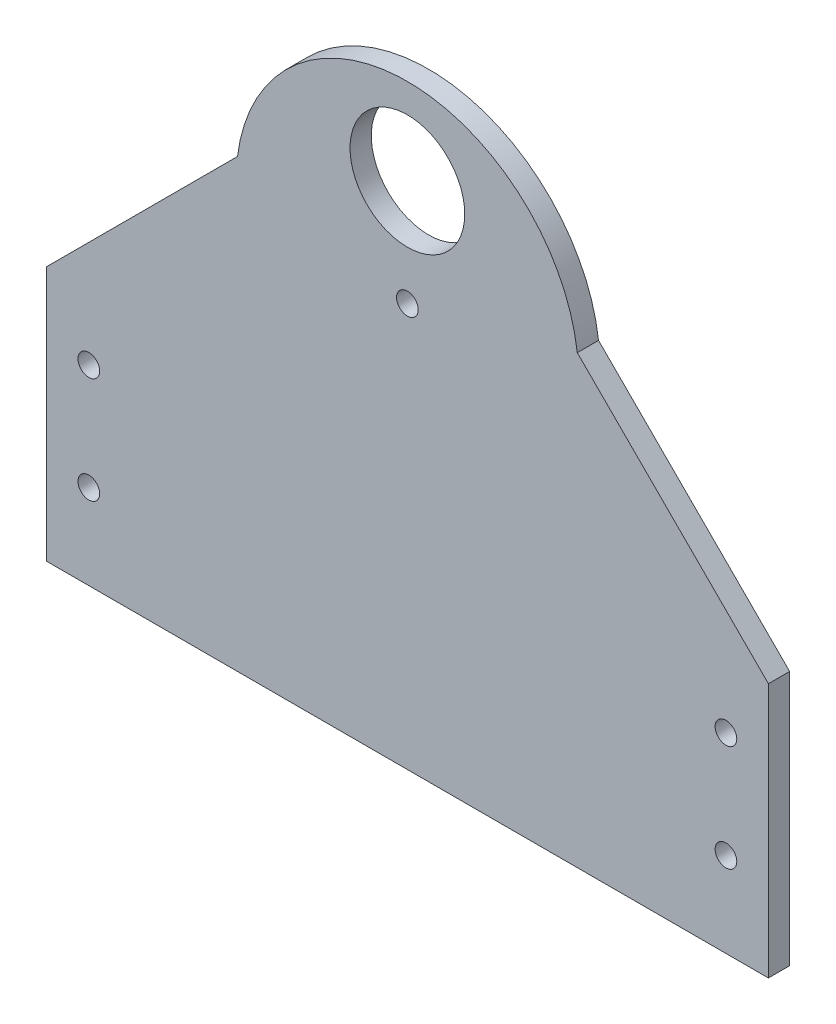
ISO-10303-21;
HEADER;
FILE_DESCRIPTION(('STEP AP214'),'2;1');
FILE_NAME('part.step','',(''),(''),'','','');
FILE_SCHEMA(('AUTOMOTIVE_DESIGN { 1 0 10303 214 1 1 1 1 }'));
ENDSEC;
DATA;
#1=APPLICATION_CONTEXT('core data for automotive mechanical design processes');
#2=APPLICATION_PROTOCOL_DEFINITION('international standard','automotive_design',2000,#1);
#3=PRODUCT_CONTEXT('',#1,'mechanical');
#4=PRODUCT('Part','Part','',(#3));
#5=PRODUCT_RELATED_PRODUCT_CATEGORY('part','',(#4));
#6=PRODUCT_DEFINITION_FORMATION('','',#4);
#7=PRODUCT_DEFINITION_CONTEXT('part definition',#1,'design');
#8=PRODUCT_DEFINITION('design','',#6,#7);
#9=PRODUCT_DEFINITION_SHAPE('','',#8);
#10=(LENGTH_UNIT() NAMED_UNIT(*) SI_UNIT(.MILLI.,.METRE.));
#11=(NAMED_UNIT(*) PLANE_ANGLE_UNIT() SI_UNIT($,.RADIAN.));
#12=(NAMED_UNIT(*) SI_UNIT($,.STERADIAN.) SOLID_ANGLE_UNIT());
#13=UNCERTAINTY_MEASURE_WITH_UNIT(LENGTH_MEASURE(1.E-05),#10,'distance_accuracy_value','');
#14=(GEOMETRIC_REPRESENTATION_CONTEXT(3) GLOBAL_UNCERTAINTY_ASSIGNED_CONTEXT((#13)) GLOBAL_UNIT_ASSIGNED_CONTEXT((#10,
#11,#12)) REPRESENTATION_CONTEXT('',''));
#15=CARTESIAN_POINT('',(0.,0.,0.));
#16=DIRECTION('',(0.,0.,1.));
#17=DIRECTION('',(1.,0.,0.));
#18=AXIS2_PLACEMENT_3D('',#15,#16,#17);
#19=CARTESIAN_POINT('',(0.,28.5999999999999,5.));
#20=DIRECTION('',(0.,0.,-1.));
#21=DIRECTION('',(-1.,0.,0.));
#22=AXIS2_PLACEMENT_3D('',#19,#20,#21);
#23=PLANE('',#22);
#24=DIRECTION('',(1.,0.,0.));
#25=VECTOR('',#24,1.);
#26=CARTESIAN_POINT('',(85.,-71.3999999999999,5.));
#27=LINE('',#26,#25);
#28=CARTESIAN_POINT('',(-85.,-71.3999999999999,5.));
#29=VERTEX_POINT('',#28);
#30=CARTESIAN_POINT('',(85.,-71.3999999999999,5.));
#31=VERTEX_POINT('',#30);
#32=EDGE_CURVE('E129',#29,#31,#27,.T.);
#33=ORIENTED_EDGE('',*,*,#32,.T.);
#34=DIRECTION('',(0.,1.,0.));
#35=VECTOR('',#34,1.);
#36=CARTESIAN_POINT('',(85.,-11.3999999999999,5.));
#37=LINE('',#36,#35);
#38=CARTESIAN_POINT('',(85.,-11.3999999999999,5.));
#39=VERTEX_POINT('',#38);
#40=EDGE_CURVE('E87',#31,#39,#37,.T.);
#41=ORIENTED_EDGE('',*,*,#40,.T.);
#42=DIRECTION('',(-0.707106781186549,0.707106781186546,0.));
#43=VECTOR('',#42,1.);
#44=CARTESIAN_POINT('',(40.,33.6,5.));
#45=LINE('',#44,#43);
#46=CARTESIAN_POINT('',(40.,33.6,5.));
#47=VERTEX_POINT('',#46);
#48=EDGE_CURVE('E100',#39,#47,#45,.T.);
#49=ORIENTED_EDGE('',*,*,#48,.T.);
#50=CARTESIAN_POINT('',(0.,28.5999999999999,5.));
#51=DIRECTION('',(0.,0.,1.));
#52=DIRECTION('',(-1.,0.,0.));
#53=AXIS2_PLACEMENT_3D('',#50,#51,#52);
#54=CIRCLE('',#53,40.3112887414928);
#55=CARTESIAN_POINT('',(-40.,33.6,5.));
#56=VERTEX_POINT('',#55);
#57=EDGE_CURVE('E94',#47,#56,#54,.T.);
#58=ORIENTED_EDGE('',*,*,#57,.T.);
#59=DIRECTION('',(-0.707106781186549,-0.707106781186546,0.));
#60=VECTOR('',#59,1.);
#61=CARTESIAN_POINT('',(-85.,-11.3999999999999,5.));
#62=LINE('',#61,#60);
#63=CARTESIAN_POINT('',(-85.,-11.3999999999999,5.));
#64=VERTEX_POINT('',#63);
#65=EDGE_CURVE('E98',#56,#64,#62,.T.);
#66=ORIENTED_EDGE('',*,*,#65,.T.);
#67=DIRECTION('',(0.,-1.,0.));
#68=VECTOR('',#67,1.);
#69=CARTESIAN_POINT('',(-85.,-71.3999999999999,5.));
#70=LINE('',#69,#68);
#71=EDGE_CURVE('E50',#64,#29,#70,.T.);
#72=ORIENTED_EDGE('',*,*,#71,.T.);
#73=EDGE_LOOP('',(#33,#41,#49,#58,#66,#72));
#74=FACE_BOUND('',#73,.T.);
#75=CARTESIAN_POINT('',(75.,-26.3999999999999,5.));
#76=DIRECTION('',(0.,0.,1.));
#77=DIRECTION('',(1.,0.,0.));
#78=AXIS2_PLACEMENT_3D('',#75,#76,#77);
#79=CIRCLE('',#78,2.54999999999999);
#80=CARTESIAN_POINT('',(77.55,-26.3999999999999,5.));
#81=VERTEX_POINT('',#80);
#82=EDGE_CURVE('E122',#81,#81,#79,.T.);
#83=ORIENTED_EDGE('',*,*,#82,.F.);
#84=EDGE_LOOP('',(#83));
#85=FACE_BOUND('',#84,.T.);
#86=CARTESIAN_POINT('',(75.,-51.3999999999999,5.));
#87=DIRECTION('',(0.,0.,1.));
#88=DIRECTION('',(1.,0.,0.));
#89=AXIS2_PLACEMENT_3D('',#86,#87,#88);
#90=CIRCLE('',#89,2.54999999999999);
#91=CARTESIAN_POINT('',(77.55,-51.3999999999999,5.));
#92=VERTEX_POINT('',#91);
#93=EDGE_CURVE('E213',#92,#92,#90,.T.);
#94=ORIENTED_EDGE('',*,*,#93,.F.);
#95=EDGE_LOOP('',(#94));
#96=FACE_BOUND('',#95,.T.);
#97=CARTESIAN_POINT('',(-75.,-26.3999999999999,5.));
#98=DIRECTION('',(0.,0.,1.));
#99=DIRECTION('',(1.,0.,0.));
#100=AXIS2_PLACEMENT_3D('',#97,#98,#99);
#101=CIRCLE('',#100,2.54999999999999);
#102=CARTESIAN_POINT('',(-72.45,-26.3999999999999,5.));
#103=VERTEX_POINT('',#102);
#104=EDGE_CURVE('E207',#103,#103,#101,.T.);
#105=ORIENTED_EDGE('',*,*,#104,.F.);
#106=EDGE_LOOP('',(#105));
#107=FACE_BOUND('',#106,.T.);
#108=CARTESIAN_POINT('',(-75.,-51.3999999999999,5.));
#109=DIRECTION('',(0.,0.,1.));
#110=DIRECTION('',(1.,0.,0.));
#111=AXIS2_PLACEMENT_3D('',#108,#109,#110);
#112=CIRCLE('',#111,2.54999999999999);
#113=CARTESIAN_POINT('',(-72.45,-51.3999999999999,5.));
#114=VERTEX_POINT('',#113);
#115=EDGE_CURVE('E201',#114,#114,#112,.T.);
#116=ORIENTED_EDGE('',*,*,#115,.F.);
#117=EDGE_LOOP('',(#116));
#118=FACE_BOUND('',#117,.T.);
#119=CARTESIAN_POINT('',(0.,23.6,5.));
#120=DIRECTION('',(0.,0.,1.));
#121=DIRECTION('',(1.,0.,0.));
#122=AXIS2_PLACEMENT_3D('',#119,#120,#121);
#123=CIRCLE('',#122,2.55);
#124=CARTESIAN_POINT('',(2.55000000000001,23.6,5.));
#125=VERTEX_POINT('',#124);
#126=EDGE_CURVE('E195',#125,#125,#123,.T.);
#127=ORIENTED_EDGE('',*,*,#126,.F.);
#128=EDGE_LOOP('',(#127));
#129=FACE_BOUND('',#128,.T.);
#130=CARTESIAN_POINT('',(0.,48.6,5.));
#131=DIRECTION('',(0.,0.,1.));
#132=DIRECTION('',(1.,0.,0.));
#133=AXIS2_PLACEMENT_3D('',#130,#131,#132);
#134=CIRCLE('',#133,13.5);
#135=CARTESIAN_POINT('',(13.5,48.6,5.));
#136=VERTEX_POINT('',#135);
#137=EDGE_CURVE('E186',#136,#136,#134,.T.);
#138=ORIENTED_EDGE('',*,*,#137,.F.);
#139=EDGE_LOOP('',(#138));
#140=FACE_BOUND('',#139,.T.);
#141=ADVANCED_FACE('F33',(#74,#85,#96,#107,#118,#129,#140),#23,.F.);
#142=CARTESIAN_POINT('',(0.,28.5999999999999,0.));
#143=DIRECTION('',(0.,0.,-1.));
#144=DIRECTION('',(-1.,0.,0.));
#145=AXIS2_PLACEMENT_3D('',#142,#143,#144);
#146=PLANE('',#145);
#147=CARTESIAN_POINT('',(0.,23.6,0.));
#148=DIRECTION('',(0.,0.,1.));
#149=DIRECTION('',(1.,0.,0.));
#150=AXIS2_PLACEMENT_3D('',#147,#148,#149);
#151=CIRCLE('',#150,2.55);
#152=CARTESIAN_POINT('',(2.55000000000001,23.6,0.));
#153=VERTEX_POINT('',#152);
#154=EDGE_CURVE('E192',#153,#153,#151,.T.);
#155=ORIENTED_EDGE('',*,*,#154,.T.);
#156=EDGE_LOOP('',(#155));
#157=FACE_BOUND('',#156,.T.);
#158=CARTESIAN_POINT('',(-75.,-26.3999999999999,0.));
#159=DIRECTION('',(0.,0.,1.));
#160=DIRECTION('',(1.,0.,0.));
#161=AXIS2_PLACEMENT_3D('',#158,#159,#160);
#162=CIRCLE('',#161,2.54999999999999);
#163=CARTESIAN_POINT('',(-72.45,-26.3999999999999,0.));
#164=VERTEX_POINT('',#163);
#165=EDGE_CURVE('E204',#164,#164,#162,.T.);
#166=ORIENTED_EDGE('',*,*,#165,.T.);
#167=EDGE_LOOP('',(#166));
#168=FACE_BOUND('',#167,.T.);
#169=CARTESIAN_POINT('',(75.,-26.3999999999999,0.));
#170=DIRECTION('',(0.,0.,1.));
#171=DIRECTION('',(1.,0.,0.));
#172=AXIS2_PLACEMENT_3D('',#169,#170,#171);
#173=CIRCLE('',#172,2.54999999999999);
#174=CARTESIAN_POINT('',(77.55,-26.3999999999999,0.));
#175=VERTEX_POINT('',#174);
#176=EDGE_CURVE('E216',#175,#175,#173,.T.);
#177=ORIENTED_EDGE('',*,*,#176,.T.);
#178=EDGE_LOOP('',(#177));
#179=FACE_BOUND('',#178,.T.);
#180=DIRECTION('',(1.,0.,0.));
#181=VECTOR('',#180,1.);
#182=CARTESIAN_POINT('',(85.,-71.3999999999999,0.));
#183=LINE('',#182,#181);
#184=CARTESIAN_POINT('',(-85.,-71.3999999999999,0.));
#185=VERTEX_POINT('',#184);
#186=CARTESIAN_POINT('',(85.,-71.3999999999999,0.));
#187=VERTEX_POINT('',#186);
#188=EDGE_CURVE('E118',#185,#187,#183,.T.);
#189=ORIENTED_EDGE('',*,*,#188,.F.);
#190=DIRECTION('',(0.,-1.,0.));
#191=VECTOR('',#190,1.);
#192=CARTESIAN_POINT('',(-85.,-71.3999999999999,0.));
#193=LINE('',#192,#191);
#194=CARTESIAN_POINT('',(-85.,-11.3999999999999,0.));
#195=VERTEX_POINT('',#194);
#196=EDGE_CURVE('E79',#195,#185,#193,.T.);
#197=ORIENTED_EDGE('',*,*,#196,.F.);
#198=DIRECTION('',(-0.707106781186549,-0.707106781186546,0.));
#199=VECTOR('',#198,1.);
#200=CARTESIAN_POINT('',(-85.,-11.3999999999999,0.));
#201=LINE('',#200,#199);
#202=CARTESIAN_POINT('',(-40.,33.6,0.));
#203=VERTEX_POINT('',#202);
#204=EDGE_CURVE('E73',#203,#195,#201,.T.);
#205=ORIENTED_EDGE('',*,*,#204,.F.);
#206=CARTESIAN_POINT('',(0.,28.5999999999999,0.));
#207=DIRECTION('',(0.,0.,1.));
#208=DIRECTION('',(-1.,0.,0.));
#209=AXIS2_PLACEMENT_3D('',#206,#207,#208);
#210=CIRCLE('',#209,40.3112887414928);
#211=CARTESIAN_POINT('',(40.,33.6,0.));
#212=VERTEX_POINT('',#211);
#213=EDGE_CURVE('E108',#212,#203,#210,.T.);
#214=ORIENTED_EDGE('',*,*,#213,.F.);
#215=DIRECTION('',(-0.707106781186549,0.707106781186546,0.));
#216=VECTOR('',#215,1.);
#217=CARTESIAN_POINT('',(40.,33.6,0.));
#218=LINE('',#217,#216);
#219=CARTESIAN_POINT('',(85.,-11.3999999999999,0.));
#220=VERTEX_POINT('',#219);
#221=EDGE_CURVE('E124',#220,#212,#218,.T.);
#222=ORIENTED_EDGE('',*,*,#221,.F.);
#223=DIRECTION('',(0.,1.,0.));
#224=VECTOR('',#223,1.);
#225=CARTESIAN_POINT('',(85.,-11.3999999999999,0.));
#226=LINE('',#225,#224);
#227=EDGE_CURVE('E121',#187,#220,#226,.T.);
#228=ORIENTED_EDGE('',*,*,#227,.F.);
#229=EDGE_LOOP('',(#189,#197,#205,#214,#222,#228));
#230=FACE_BOUND('',#229,.T.);
#231=CARTESIAN_POINT('',(75.,-51.3999999999999,0.));
#232=DIRECTION('',(0.,0.,1.));
#233=DIRECTION('',(1.,0.,0.));
#234=AXIS2_PLACEMENT_3D('',#231,#232,#233);
#235=CIRCLE('',#234,2.54999999999999);
#236=CARTESIAN_POINT('',(77.55,-51.3999999999999,0.));
#237=VERTEX_POINT('',#236);
#238=EDGE_CURVE('E210',#237,#237,#235,.T.);
#239=ORIENTED_EDGE('',*,*,#238,.T.);
#240=EDGE_LOOP('',(#239));
#241=FACE_BOUND('',#240,.T.);
#242=CARTESIAN_POINT('',(-75.,-51.3999999999999,0.));
#243=DIRECTION('',(0.,0.,1.));
#244=DIRECTION('',(1.,0.,0.));
#245=AXIS2_PLACEMENT_3D('',#242,#243,#244);
#246=CIRCLE('',#245,2.54999999999999);
#247=CARTESIAN_POINT('',(-72.45,-51.3999999999999,0.));
#248=VERTEX_POINT('',#247);
#249=EDGE_CURVE('E198',#248,#248,#246,.T.);
#250=ORIENTED_EDGE('',*,*,#249,.T.);
#251=EDGE_LOOP('',(#250));
#252=FACE_BOUND('',#251,.T.);
#253=CARTESIAN_POINT('',(0.,48.6,0.));
#254=DIRECTION('',(0.,0.,1.));
#255=DIRECTION('',(1.,0.,0.));
#256=AXIS2_PLACEMENT_3D('',#253,#254,#255);
#257=CIRCLE('',#256,13.5);
#258=CARTESIAN_POINT('',(13.5,48.6,0.));
#259=VERTEX_POINT('',#258);
#260=EDGE_CURVE('E189',#259,#259,#257,.T.);
#261=ORIENTED_EDGE('',*,*,#260,.T.);
#262=EDGE_LOOP('',(#261));
#263=FACE_BOUND('',#262,.T.);
#264=ADVANCED_FACE('F138',(#157,#168,#179,#230,#241,#252,#263),#146,.T.);
#265=CARTESIAN_POINT('',(85.,-71.3999999999999,5.));
#266=DIRECTION('',(0.,1.,0.));
#267=DIRECTION('',(0.,0.,1.));
#268=AXIS2_PLACEMENT_3D('',#265,#266,#267);
#269=PLANE('',#268);
#270=ORIENTED_EDGE('',*,*,#188,.T.);
#271=DIRECTION('',(0.,0.,-1.));
#272=VECTOR('',#271,1.);
#273=CARTESIAN_POINT('',(85.,-71.3999999999999,5.));
#274=LINE('',#273,#272);
#275=EDGE_CURVE('E11',#31,#187,#274,.T.);
#276=ORIENTED_EDGE('',*,*,#275,.F.);
#277=ORIENTED_EDGE('',*,*,#32,.F.);
#278=DIRECTION('',(0.,0.,-1.));
#279=VECTOR('',#278,1.);
#280=CARTESIAN_POINT('',(-85.,-71.3999999999999,5.));
#281=LINE('',#280,#279);
#282=EDGE_CURVE('E114',#29,#185,#281,.T.);
#283=ORIENTED_EDGE('',*,*,#282,.T.);
#284=EDGE_LOOP('',(#270,#276,#277,#283));
#285=FACE_BOUND('',#284,.T.);
#286=ADVANCED_FACE('F35',(#285),#269,.F.);
#287=CARTESIAN_POINT('',(85.,-11.3999999999999,5.));
#288=DIRECTION('',(-1.,0.,0.));
#289=DIRECTION('',(0.,0.,1.));
#290=AXIS2_PLACEMENT_3D('',#287,#288,#289);
#291=PLANE('',#290);
#292=ORIENTED_EDGE('',*,*,#227,.T.);
#293=DIRECTION('',(0.,0.,-1.));
#294=VECTOR('',#293,1.);
#295=CARTESIAN_POINT('',(85.,-11.3999999999999,5.));
#296=LINE('',#295,#294);
#297=EDGE_CURVE('E42',#39,#220,#296,.T.);
#298=ORIENTED_EDGE('',*,*,#297,.F.);
#299=ORIENTED_EDGE('',*,*,#40,.F.);
#300=ORIENTED_EDGE('',*,*,#275,.T.);
#301=EDGE_LOOP('',(#292,#298,#299,#300));
#302=FACE_BOUND('',#301,.T.);
#303=ADVANCED_FACE('F294',(#302),#291,.F.);
#304=CARTESIAN_POINT('',(40.,33.6,5.));
#305=DIRECTION('',(-0.707106781186546,-0.707106781186549,0.));
#306=DIRECTION('',(0.707106781186549,-0.707106781186546,0.));
#307=AXIS2_PLACEMENT_3D('',#304,#305,#306);
#308=PLANE('',#307);
#309=ORIENTED_EDGE('',*,*,#221,.T.);
#310=DIRECTION('',(0.,0.,-1.));
#311=VECTOR('',#310,1.);
#312=CARTESIAN_POINT('',(40.,33.6,5.));
#313=LINE('',#312,#311);
#314=EDGE_CURVE('E109',#47,#212,#313,.T.);
#315=ORIENTED_EDGE('',*,*,#314,.F.);
#316=ORIENTED_EDGE('',*,*,#48,.F.);
#317=ORIENTED_EDGE('',*,*,#297,.T.);
#318=EDGE_LOOP('',(#309,#315,#316,#317));
#319=FACE_BOUND('',#318,.T.);
#320=ADVANCED_FACE('F135',(#319),#308,.F.);
#321=CARTESIAN_POINT('',(0.,28.5999999999999,5.));
#322=DIRECTION('',(0.,0.,-1.));
#323=DIRECTION('',(-1.,0.,0.));
#324=AXIS2_PLACEMENT_3D('',#321,#322,#323);
#325=CYLINDRICAL_SURFACE('',#324,40.3112887414928);
#326=ORIENTED_EDGE('',*,*,#213,.T.);
#327=DIRECTION('',(0.,0.,-1.));
#328=VECTOR('',#327,1.);
#329=CARTESIAN_POINT('',(-40.,33.6,5.));
#330=LINE('',#329,#328);
#331=EDGE_CURVE('E105',#56,#203,#330,.T.);
#332=ORIENTED_EDGE('',*,*,#331,.F.);
#333=ORIENTED_EDGE('',*,*,#57,.F.);
#334=ORIENTED_EDGE('',*,*,#314,.T.);
#335=EDGE_LOOP('',(#326,#332,#333,#334));
#336=FACE_BOUND('',#335,.T.);
#337=ADVANCED_FACE('F106',(#336),#325,.T.);
#338=CARTESIAN_POINT('',(-85.,-11.3999999999999,5.));
#339=DIRECTION('',(0.707106781186546,-0.707106781186549,0.));
#340=DIRECTION('',(0.707106781186549,0.707106781186546,0.));
#341=AXIS2_PLACEMENT_3D('',#338,#339,#340);
#342=PLANE('',#341);
#343=ORIENTED_EDGE('',*,*,#204,.T.);
#344=DIRECTION('',(0.,0.,-1.));
#345=VECTOR('',#344,1.);
#346=CARTESIAN_POINT('',(-85.,-11.3999999999999,5.));
#347=LINE('',#346,#345);
#348=EDGE_CURVE('E110',#64,#195,#347,.T.);
#349=ORIENTED_EDGE('',*,*,#348,.F.);
#350=ORIENTED_EDGE('',*,*,#65,.F.);
#351=ORIENTED_EDGE('',*,*,#331,.T.);
#352=EDGE_LOOP('',(#343,#349,#350,#351));
#353=FACE_BOUND('',#352,.T.);
#354=ADVANCED_FACE('F112',(#353),#342,.F.);
#355=CARTESIAN_POINT('',(-85.,-71.3999999999999,5.));
#356=DIRECTION('',(1.,0.,0.));
#357=DIRECTION('',(0.,0.,-1.));
#358=AXIS2_PLACEMENT_3D('',#355,#356,#357);
#359=PLANE('',#358);
#360=ORIENTED_EDGE('',*,*,#196,.T.);
#361=ORIENTED_EDGE('',*,*,#282,.F.);
#362=ORIENTED_EDGE('',*,*,#71,.F.);
#363=ORIENTED_EDGE('',*,*,#348,.T.);
#364=EDGE_LOOP('',(#360,#361,#362,#363));
#365=FACE_BOUND('',#364,.T.);
#366=ADVANCED_FACE('F143',(#365),#359,.F.);
#367=CARTESIAN_POINT('',(75.,-26.3999999999999,5.));
#368=DIRECTION('',(0.,0.,-1.));
#369=DIRECTION('',(-1.,0.,0.));
#370=AXIS2_PLACEMENT_3D('',#367,#368,#369);
#371=CYLINDRICAL_SURFACE('',#370,2.54999999999999);
#372=ORIENTED_EDGE('',*,*,#82,.T.);
#373=EDGE_LOOP('',(#372));
#374=FACE_BOUND('',#373,.T.);
#375=ORIENTED_EDGE('',*,*,#176,.F.);
#376=EDGE_LOOP('',(#375));
#377=FACE_BOUND('',#376,.T.);
#378=ADVANCED_FACE('F145',(#374,#377),#371,.F.);
#379=CARTESIAN_POINT('',(75.,-51.3999999999999,5.));
#380=DIRECTION('',(0.,0.,-1.));
#381=DIRECTION('',(-1.,0.,0.));
#382=AXIS2_PLACEMENT_3D('',#379,#380,#381);
#383=CYLINDRICAL_SURFACE('',#382,2.54999999999999);
#384=ORIENTED_EDGE('',*,*,#93,.T.);
#385=EDGE_LOOP('',(#384));
#386=FACE_BOUND('',#385,.T.);
#387=ORIENTED_EDGE('',*,*,#238,.F.);
#388=EDGE_LOOP('',(#387));
#389=FACE_BOUND('',#388,.T.);
#390=ADVANCED_FACE('F151',(#386,#389),#383,.F.);
#391=CARTESIAN_POINT('',(-75.,-26.3999999999999,5.));
#392=DIRECTION('',(0.,0.,-1.));
#393=DIRECTION('',(-1.,0.,0.));
#394=AXIS2_PLACEMENT_3D('',#391,#392,#393);
#395=CYLINDRICAL_SURFACE('',#394,2.54999999999999);
#396=ORIENTED_EDGE('',*,*,#104,.T.);
#397=EDGE_LOOP('',(#396));
#398=FACE_BOUND('',#397,.T.);
#399=ORIENTED_EDGE('',*,*,#165,.F.);
#400=EDGE_LOOP('',(#399));
#401=FACE_BOUND('',#400,.T.);
#402=ADVANCED_FACE('F165',(#398,#401),#395,.F.);
#403=CARTESIAN_POINT('',(-75.,-51.3999999999999,5.));
#404=DIRECTION('',(0.,0.,-1.));
#405=DIRECTION('',(-1.,0.,0.));
#406=AXIS2_PLACEMENT_3D('',#403,#404,#405);
#407=CYLINDRICAL_SURFACE('',#406,2.54999999999999);
#408=ORIENTED_EDGE('',*,*,#115,.T.);
#409=EDGE_LOOP('',(#408));
#410=FACE_BOUND('',#409,.T.);
#411=ORIENTED_EDGE('',*,*,#249,.F.);
#412=EDGE_LOOP('',(#411));
#413=FACE_BOUND('',#412,.T.);
#414=ADVANCED_FACE('F169',(#410,#413),#407,.F.);
#415=CARTESIAN_POINT('',(0.,23.6,5.));
#416=DIRECTION('',(0.,0.,-1.));
#417=DIRECTION('',(-1.,0.,0.));
#418=AXIS2_PLACEMENT_3D('',#415,#416,#417);
#419=CYLINDRICAL_SURFACE('',#418,2.55);
#420=ORIENTED_EDGE('',*,*,#126,.T.);
#421=EDGE_LOOP('',(#420));
#422=FACE_BOUND('',#421,.T.);
#423=ORIENTED_EDGE('',*,*,#154,.F.);
#424=EDGE_LOOP('',(#423));
#425=FACE_BOUND('',#424,.T.);
#426=ADVANCED_FACE('F173',(#422,#425),#419,.F.);
#427=CARTESIAN_POINT('',(0.,48.6,5.));
#428=DIRECTION('',(0.,0.,-1.));
#429=DIRECTION('',(-1.,0.,0.));
#430=AXIS2_PLACEMENT_3D('',#427,#428,#429);
#431=CYLINDRICAL_SURFACE('',#430,13.5);
#432=ORIENTED_EDGE('',*,*,#137,.T.);
#433=EDGE_LOOP('',(#432));
#434=FACE_BOUND('',#433,.T.);
#435=ORIENTED_EDGE('',*,*,#260,.F.);
#436=EDGE_LOOP('',(#435));
#437=FACE_BOUND('',#436,.T.);
#438=ADVANCED_FACE('F177',(#434,#437),#431,.F.);
#439=CLOSED_SHELL('',(#141,#264,#286,#303,#320,#337,#354,#366,#378,#390,#402,#414,#426,#438));
#440=MANIFOLD_SOLID_BREP('B2',#439);
#441=ADVANCED_BREP_SHAPE_REPRESENTATION('',(#18,#440),#14);
#442=SHAPE_DEFINITION_REPRESENTATION(#9,#441);
ENDSEC;
END-ISO-10303-21;
